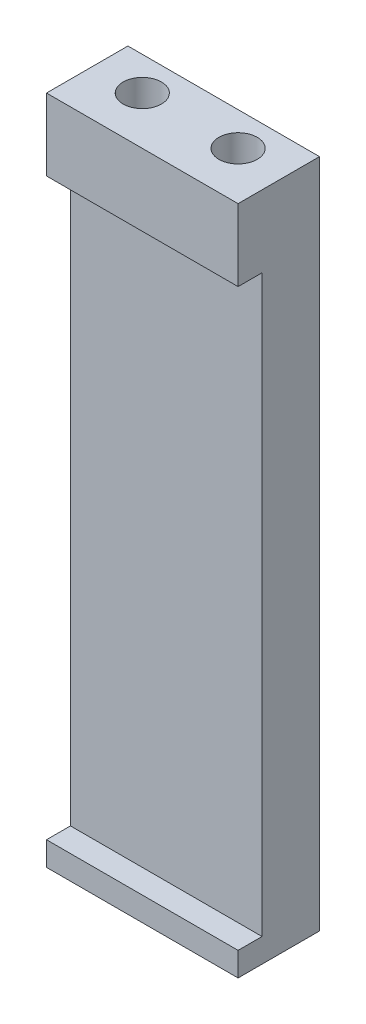
ISO-10303-21;
HEADER;
FILE_DESCRIPTION(('STEP AP214'),'2;1');
FILE_NAME('part.step','',(''),(''),'','','');
FILE_SCHEMA(('AUTOMOTIVE_DESIGN { 1 0 10303 214 1 1 1 1 }'));
ENDSEC;
DATA;
#1=APPLICATION_CONTEXT('core data for automotive mechanical design processes');
#2=APPLICATION_PROTOCOL_DEFINITION('international standard','automotive_design',2000,#1);
#3=PRODUCT_CONTEXT('',#1,'mechanical');
#4=PRODUCT('Part','Part','',(#3));
#5=PRODUCT_RELATED_PRODUCT_CATEGORY('part','',(#4));
#6=PRODUCT_DEFINITION_FORMATION('','',#4);
#7=PRODUCT_DEFINITION_CONTEXT('part definition',#1,'design');
#8=PRODUCT_DEFINITION('design','',#6,#7);
#9=PRODUCT_DEFINITION_SHAPE('','',#8);
#10=(LENGTH_UNIT() NAMED_UNIT(*) SI_UNIT(.MILLI.,.METRE.));
#11=(NAMED_UNIT(*) PLANE_ANGLE_UNIT() SI_UNIT($,.RADIAN.));
#12=(NAMED_UNIT(*) SI_UNIT($,.STERADIAN.) SOLID_ANGLE_UNIT());
#13=UNCERTAINTY_MEASURE_WITH_UNIT(LENGTH_MEASURE(1.E-05),#10,'distance_accuracy_value','');
#14=(GEOMETRIC_REPRESENTATION_CONTEXT(3) GLOBAL_UNCERTAINTY_ASSIGNED_CONTEXT((#13)) GLOBAL_UNIT_ASSIGNED_CONTEXT((#10,
#11,#12)) REPRESENTATION_CONTEXT('',''));
#15=CARTESIAN_POINT('',(0.,0.,0.));
#16=DIRECTION('',(0.,0.,1.));
#17=DIRECTION('',(1.,0.,0.));
#18=AXIS2_PLACEMENT_3D('',#15,#16,#17);
#19=CARTESIAN_POINT('',(10.,61.25,2.5));
#20=DIRECTION('',(0.,0.,1.));
#21=DIRECTION('',(1.,0.,0.));
#22=AXIS2_PLACEMENT_3D('',#19,#20,#21);
#23=PLANE('',#22);
#24=DIRECTION('',(0.,1.,0.));
#25=VECTOR('',#24,1.);
#26=CARTESIAN_POINT('',(20.,60.,2.5));
#27=LINE('',#26,#25);
#28=CARTESIAN_POINT('',(20.,60.,2.5));
#29=VERTEX_POINT('',#28);
#30=CARTESIAN_POINT('',(20.,67.5,2.5));
#31=VERTEX_POINT('',#30);
#32=EDGE_CURVE('E10',#29,#31,#27,.T.);
#33=ORIENTED_EDGE('',*,*,#32,.T.);
#34=DIRECTION('',(1.,0.,0.));
#35=VECTOR('',#34,1.);
#36=CARTESIAN_POINT('',(22.5,67.5,2.5));
#37=LINE('',#36,#35);
#38=CARTESIAN_POINT('',(0.,67.5,2.5));
#39=VERTEX_POINT('',#38);
#40=EDGE_CURVE('E131',#39,#31,#37,.T.);
#41=ORIENTED_EDGE('',*,*,#40,.F.);
#42=DIRECTION('',(0.,1.,0.));
#43=VECTOR('',#42,1.);
#44=CARTESIAN_POINT('',(0.,62.5,2.5));
#45=LINE('',#44,#43);
#46=CARTESIAN_POINT('',(0.,60.,2.5));
#47=VERTEX_POINT('',#46);
#48=EDGE_CURVE('E26',#47,#39,#45,.T.);
#49=ORIENTED_EDGE('',*,*,#48,.F.);
#50=DIRECTION('',(1.,0.,0.));
#51=VECTOR('',#50,1.);
#52=CARTESIAN_POINT('',(20.,60.,2.5));
#53=LINE('',#52,#51);
#54=EDGE_CURVE('E20',#47,#29,#53,.T.);
#55=ORIENTED_EDGE('',*,*,#54,.T.);
#56=EDGE_LOOP('',(#33,#41,#49,#55));
#57=FACE_BOUND('',#56,.T.);
#58=ADVANCED_FACE('F16',(#57),#23,.T.);
#59=CARTESIAN_POINT('',(20.,60.,0.));
#60=DIRECTION('',(1.,0.,0.));
#61=DIRECTION('',(0.,1.,0.));
#62=AXIS2_PLACEMENT_3D('',#59,#60,#61);
#63=PLANE('',#62);
#64=ORIENTED_EDGE('',*,*,#32,.F.);
#65=DIRECTION('',(0.,0.,1.));
#66=VECTOR('',#65,1.);
#67=CARTESIAN_POINT('',(20.,60.,0.));
#68=LINE('',#67,#66);
#69=CARTESIAN_POINT('',(20.,60.,0.));
#70=VERTEX_POINT('',#69);
#71=EDGE_CURVE('E192',#70,#29,#68,.T.);
#72=ORIENTED_EDGE('',*,*,#71,.F.);
#73=DIRECTION('',(0.,-1.,0.));
#74=VECTOR('',#73,1.);
#75=CARTESIAN_POINT('',(20.,0.,0.));
#76=LINE('',#75,#74);
#77=CARTESIAN_POINT('',(20.,0.,0.));
#78=VERTEX_POINT('',#77);
#79=EDGE_CURVE('E149',#70,#78,#76,.T.);
#80=ORIENTED_EDGE('',*,*,#79,.T.);
#81=DIRECTION('',(0.,0.,1.));
#82=VECTOR('',#81,1.);
#83=CARTESIAN_POINT('',(20.,0.,0.));
#84=LINE('',#83,#82);
#85=CARTESIAN_POINT('',(20.,0.,2.5));
#86=VERTEX_POINT('',#85);
#87=EDGE_CURVE('E172',#78,#86,#84,.T.);
#88=ORIENTED_EDGE('',*,*,#87,.T.);
#89=DIRECTION('',(0.,1.,0.));
#90=VECTOR('',#89,1.);
#91=CARTESIAN_POINT('',(20.,0.,2.5));
#92=LINE('',#91,#90);
#93=CARTESIAN_POINT('',(20.,-2.5,2.5));
#94=VERTEX_POINT('',#93);
#95=EDGE_CURVE('E190',#94,#86,#92,.T.);
#96=ORIENTED_EDGE('',*,*,#95,.F.);
#97=DIRECTION('',(0.,0.,1.));
#98=VECTOR('',#97,1.);
#99=CARTESIAN_POINT('',(20.,-2.5,0.));
#100=LINE('',#99,#98);
#101=CARTESIAN_POINT('',(20.,-2.5,-6.));
#102=VERTEX_POINT('',#101);
#103=EDGE_CURVE('E176',#102,#94,#100,.T.);
#104=ORIENTED_EDGE('',*,*,#103,.F.);
#105=DIRECTION('',(0.,1.,0.));
#106=VECTOR('',#105,1.);
#107=CARTESIAN_POINT('',(20.,45.,-6.));
#108=LINE('',#107,#106);
#109=CARTESIAN_POINT('',(20.,67.5,-6.));
#110=VERTEX_POINT('',#109);
#111=EDGE_CURVE('E147',#102,#110,#108,.T.);
#112=ORIENTED_EDGE('',*,*,#111,.T.);
#113=DIRECTION('',(0.,0.,-1.));
#114=VECTOR('',#113,1.);
#115=CARTESIAN_POINT('',(20.,67.5,0.));
#116=LINE('',#115,#114);
#117=EDGE_CURVE('E123',#31,#110,#116,.T.);
#118=ORIENTED_EDGE('',*,*,#117,.F.);
#119=EDGE_LOOP('',(#64,#72,#80,#88,#96,#104,#112,#118));
#120=FACE_BOUND('',#119,.T.);
#121=ADVANCED_FACE('F247',(#120),#63,.T.);
#122=CARTESIAN_POINT('',(0.,62.5,0.));
#123=DIRECTION('',(-1.,0.,0.));
#124=DIRECTION('',(0.,1.,0.));
#125=AXIS2_PLACEMENT_3D('',#122,#123,#124);
#126=PLANE('',#125);
#127=DIRECTION('',(0.,0.,1.));
#128=VECTOR('',#127,1.);
#129=CARTESIAN_POINT('',(0.,60.,0.));
#130=LINE('',#129,#128);
#131=CARTESIAN_POINT('',(0.,60.,0.));
#132=VERTEX_POINT('',#131);
#133=EDGE_CURVE('E159',#132,#47,#130,.T.);
#134=ORIENTED_EDGE('',*,*,#133,.T.);
#135=ORIENTED_EDGE('',*,*,#48,.T.);
#136=DIRECTION('',(0.,0.,1.));
#137=VECTOR('',#136,1.);
#138=CARTESIAN_POINT('',(0.,67.5,0.));
#139=LINE('',#138,#137);
#140=CARTESIAN_POINT('',(0.,67.5,-6.));
#141=VERTEX_POINT('',#140);
#142=EDGE_CURVE('E121',#141,#39,#139,.T.);
#143=ORIENTED_EDGE('',*,*,#142,.F.);
#144=DIRECTION('',(0.,1.,0.));
#145=VECTOR('',#144,1.);
#146=CARTESIAN_POINT('',(0.,46.25,-6.));
#147=LINE('',#146,#145);
#148=CARTESIAN_POINT('',(0.,-2.5,-6.));
#149=VERTEX_POINT('',#148);
#150=EDGE_CURVE('E103',#149,#141,#147,.T.);
#151=ORIENTED_EDGE('',*,*,#150,.F.);
#152=DIRECTION('',(0.,0.,1.));
#153=VECTOR('',#152,1.);
#154=CARTESIAN_POINT('',(0.,-2.5,0.));
#155=LINE('',#154,#153);
#156=CARTESIAN_POINT('',(0.,-2.5,2.5));
#157=VERTEX_POINT('',#156);
#158=EDGE_CURVE('E184',#149,#157,#155,.T.);
#159=ORIENTED_EDGE('',*,*,#158,.T.);
#160=DIRECTION('',(0.,-1.,0.));
#161=VECTOR('',#160,1.);
#162=CARTESIAN_POINT('',(0.,0.,2.5));
#163=LINE('',#162,#161);
#164=CARTESIAN_POINT('',(0.,0.,2.5));
#165=VERTEX_POINT('',#164);
#166=EDGE_CURVE('E187',#165,#157,#163,.T.);
#167=ORIENTED_EDGE('',*,*,#166,.F.);
#168=DIRECTION('',(0.,0.,1.));
#169=VECTOR('',#168,1.);
#170=CARTESIAN_POINT('',(0.,0.,0.));
#171=LINE('',#170,#169);
#172=CARTESIAN_POINT('',(0.,0.,0.));
#173=VERTEX_POINT('',#172);
#174=EDGE_CURVE('E115',#173,#165,#171,.T.);
#175=ORIENTED_EDGE('',*,*,#174,.F.);
#176=DIRECTION('',(0.,1.,0.));
#177=VECTOR('',#176,1.);
#178=CARTESIAN_POINT('',(0.,60.,0.));
#179=LINE('',#178,#177);
#180=EDGE_CURVE('E156',#173,#132,#179,.T.);
#181=ORIENTED_EDGE('',*,*,#180,.T.);
#182=EDGE_LOOP('',(#134,#135,#143,#151,#159,#167,#175,#181));
#183=FACE_BOUND('',#182,.T.);
#184=ADVANCED_FACE('F128',(#183),#126,.T.);
#185=CARTESIAN_POINT('',(0.,60.,0.));
#186=DIRECTION('',(0.,-1.,0.));
#187=DIRECTION('',(0.,0.,-1.));
#188=AXIS2_PLACEMENT_3D('',#185,#186,#187);
#189=PLANE('',#188);
#190=DIRECTION('',(-1.,0.,0.));
#191=VECTOR('',#190,1.);
#192=CARTESIAN_POINT('',(20.,60.,0.));
#193=LINE('',#192,#191);
#194=EDGE_CURVE('E125',#70,#132,#193,.T.);
#195=ORIENTED_EDGE('',*,*,#194,.F.);
#196=ORIENTED_EDGE('',*,*,#71,.T.);
#197=ORIENTED_EDGE('',*,*,#54,.F.);
#198=ORIENTED_EDGE('',*,*,#133,.F.);
#199=EDGE_LOOP('',(#195,#196,#197,#198));
#200=FACE_BOUND('',#199,.T.);
#201=ADVANCED_FACE('F18',(#200),#189,.T.);
#202=CARTESIAN_POINT('',(10.,-1.25,2.5));
#203=DIRECTION('',(0.,0.,1.));
#204=DIRECTION('',(1.,0.,0.));
#205=AXIS2_PLACEMENT_3D('',#202,#203,#204);
#206=PLANE('',#205);
#207=ORIENTED_EDGE('',*,*,#166,.T.);
#208=DIRECTION('',(1.,0.,0.));
#209=VECTOR('',#208,1.);
#210=CARTESIAN_POINT('',(-2.5,-2.5,2.5));
#211=LINE('',#210,#209);
#212=EDGE_CURVE('E180',#157,#94,#211,.T.);
#213=ORIENTED_EDGE('',*,*,#212,.T.);
#214=ORIENTED_EDGE('',*,*,#95,.T.);
#215=DIRECTION('',(-1.,0.,0.));
#216=VECTOR('',#215,1.);
#217=CARTESIAN_POINT('',(0.,0.,2.5));
#218=LINE('',#217,#216);
#219=EDGE_CURVE('E166',#86,#165,#218,.T.);
#220=ORIENTED_EDGE('',*,*,#219,.T.);
#221=EDGE_LOOP('',(#207,#213,#214,#220));
#222=FACE_BOUND('',#221,.T.);
#223=ADVANCED_FACE('F263',(#222),#206,.T.);
#224=CARTESIAN_POINT('',(0.,-2.5,0.));
#225=DIRECTION('',(0.,-1.,0.));
#226=DIRECTION('',(0.,0.,-1.));
#227=AXIS2_PLACEMENT_3D('',#224,#225,#226);
#228=PLANE('',#227);
#229=ORIENTED_EDGE('',*,*,#103,.T.);
#230=ORIENTED_EDGE('',*,*,#212,.F.);
#231=ORIENTED_EDGE('',*,*,#158,.F.);
#232=DIRECTION('',(-1.,0.,0.));
#233=VECTOR('',#232,1.);
#234=CARTESIAN_POINT('',(5.,-2.5,-6.));
#235=LINE('',#234,#233);
#236=EDGE_CURVE('E110',#102,#149,#235,.T.);
#237=ORIENTED_EDGE('',*,*,#236,.F.);
#238=EDGE_LOOP('',(#229,#230,#231,#237));
#239=FACE_BOUND('',#238,.T.);
#240=ADVANCED_FACE('F259',(#239),#228,.T.);
#241=CARTESIAN_POINT('',(20.,0.,0.));
#242=DIRECTION('',(0.,1.,0.));
#243=DIRECTION('',(1.,0.,0.));
#244=AXIS2_PLACEMENT_3D('',#241,#242,#243);
#245=PLANE('',#244);
#246=DIRECTION('',(1.,0.,0.));
#247=VECTOR('',#246,1.);
#248=CARTESIAN_POINT('',(0.,0.,0.));
#249=LINE('',#248,#247);
#250=EDGE_CURVE('E145',#173,#78,#249,.T.);
#251=ORIENTED_EDGE('',*,*,#250,.F.);
#252=ORIENTED_EDGE('',*,*,#174,.T.);
#253=ORIENTED_EDGE('',*,*,#219,.F.);
#254=ORIENTED_EDGE('',*,*,#87,.F.);
#255=EDGE_LOOP('',(#251,#252,#253,#254));
#256=FACE_BOUND('',#255,.T.);
#257=ADVANCED_FACE('F256',(#256),#245,.T.);
#258=CARTESIAN_POINT('',(10.,30.,-6.));
#259=DIRECTION('',(0.,0.,-1.));
#260=DIRECTION('',(0.,-1.,0.));
#261=AXIS2_PLACEMENT_3D('',#258,#259,#260);
#262=PLANE('',#261);
#263=ORIENTED_EDGE('',*,*,#111,.F.);
#264=ORIENTED_EDGE('',*,*,#236,.T.);
#265=ORIENTED_EDGE('',*,*,#150,.T.);
#266=DIRECTION('',(-1.,0.,0.));
#267=VECTOR('',#266,1.);
#268=CARTESIAN_POINT('',(15.,67.5,-6.));
#269=LINE('',#268,#267);
#270=EDGE_CURVE('E107',#110,#141,#269,.T.);
#271=ORIENTED_EDGE('',*,*,#270,.F.);
#272=EDGE_LOOP('',(#263,#264,#265,#271));
#273=FACE_BOUND('',#272,.T.);
#274=ADVANCED_FACE('F106',(#273),#262,.T.);
#275=CARTESIAN_POINT('',(10.,30.,0.));
#276=DIRECTION('',(0.,0.,1.));
#277=DIRECTION('',(1.,0.,0.));
#278=AXIS2_PLACEMENT_3D('',#275,#276,#277);
#279=PLANE('',#278);
#280=ORIENTED_EDGE('',*,*,#194,.T.);
#281=ORIENTED_EDGE('',*,*,#180,.F.);
#282=ORIENTED_EDGE('',*,*,#250,.T.);
#283=ORIENTED_EDGE('',*,*,#79,.F.);
#284=EDGE_LOOP('',(#280,#281,#282,#283));
#285=FACE_BOUND('',#284,.T.);
#286=ADVANCED_FACE('F210',(#285),#279,.T.);
#287=CARTESIAN_POINT('',(20.,67.5,0.));
#288=DIRECTION('',(0.,1.,0.));
#289=DIRECTION('',(1.,0.,0.));
#290=AXIS2_PLACEMENT_3D('',#287,#288,#289);
#291=PLANE('',#290);
#292=CARTESIAN_POINT('',(15.,67.5,-2.5));
#293=DIRECTION('',(0.,-1.,0.));
#294=DIRECTION('',(0.,0.,1.));
#295=AXIS2_PLACEMENT_3D('',#292,#293,#294);
#296=CIRCLE('',#295,2.);
#297=CARTESIAN_POINT('',(15.,67.5,-0.5));
#298=VERTEX_POINT('',#297);
#299=EDGE_CURVE('E132',#298,#298,#296,.T.);
#300=ORIENTED_EDGE('',*,*,#299,.T.);
#301=EDGE_LOOP('',(#300));
#302=FACE_BOUND('',#301,.T.);
#303=CARTESIAN_POINT('',(5.,67.5,-2.5));
#304=DIRECTION('',(0.,-1.,0.));
#305=DIRECTION('',(0.,0.,1.));
#306=AXIS2_PLACEMENT_3D('',#303,#304,#305);
#307=CIRCLE('',#306,2.);
#308=CARTESIAN_POINT('',(5.,67.5,-0.5));
#309=VERTEX_POINT('',#308);
#310=EDGE_CURVE('E221',#309,#309,#307,.T.);
#311=ORIENTED_EDGE('',*,*,#310,.T.);
#312=EDGE_LOOP('',(#311));
#313=FACE_BOUND('',#312,.T.);
#314=ORIENTED_EDGE('',*,*,#142,.T.);
#315=ORIENTED_EDGE('',*,*,#40,.T.);
#316=ORIENTED_EDGE('',*,*,#117,.T.);
#317=ORIENTED_EDGE('',*,*,#270,.T.);
#318=EDGE_LOOP('',(#314,#315,#316,#317));
#319=FACE_BOUND('',#318,.T.);
#320=ADVANCED_FACE('F119',(#302,#313,#319),#291,.T.);
#321=CARTESIAN_POINT('',(15.,64.5,-2.5));
#322=DIRECTION('',(0.,-1.,0.));
#323=DIRECTION('',(0.,0.,1.));
#324=AXIS2_PLACEMENT_3D('',#321,#322,#323);
#325=CYLINDRICAL_SURFACE('',#324,2.);
#326=CARTESIAN_POINT('',(15.,61.5,-2.5));
#327=DIRECTION('',(0.,-1.,0.));
#328=DIRECTION('',(0.,0.,1.));
#329=AXIS2_PLACEMENT_3D('',#326,#327,#328);
#330=CIRCLE('',#329,2.);
#331=CARTESIAN_POINT('',(15.,61.5,-0.5));
#332=VERTEX_POINT('',#331);
#333=EDGE_CURVE('E141',#332,#332,#330,.T.);
#334=ORIENTED_EDGE('',*,*,#333,.T.);
#335=EDGE_LOOP('',(#334));
#336=FACE_BOUND('',#335,.T.);
#337=ORIENTED_EDGE('',*,*,#299,.F.);
#338=EDGE_LOOP('',(#337));
#339=FACE_BOUND('',#338,.T.);
#340=ADVANCED_FACE('F310',(#336,#339),#325,.F.);
#341=CARTESIAN_POINT('',(15.,60.8991393809725,-2.5));
#342=DIRECTION('',(0.,1.,0.));
#343=DIRECTION('',(0.,0.,1.));
#344=AXIS2_PLACEMENT_3D('',#341,#342,#343);
#345=CONICAL_SURFACE('',#344,1.,1.02974425867665);
#346=CARTESIAN_POINT('',(15.,60.2982787619449,-2.5));
#347=VERTEX_POINT('',#346);
#348=VERTEX_LOOP('',#347);
#349=FACE_BOUND('',#348,.T.);
#350=ORIENTED_EDGE('',*,*,#333,.F.);
#351=EDGE_LOOP('',(#350));
#352=FACE_BOUND('',#351,.T.);
#353=ADVANCED_FACE('F244',(#349,#352),#345,.F.);
#354=CARTESIAN_POINT('',(5.,64.5,-2.5));
#355=DIRECTION('',(0.,-1.,0.));
#356=DIRECTION('',(0.,0.,1.));
#357=AXIS2_PLACEMENT_3D('',#354,#355,#356);
#358=CYLINDRICAL_SURFACE('',#357,2.);
#359=CARTESIAN_POINT('',(5.,61.5,-2.5));
#360=DIRECTION('',(0.,-1.,0.));
#361=DIRECTION('',(0.,0.,1.));
#362=AXIS2_PLACEMENT_3D('',#359,#360,#361);
#363=CIRCLE('',#362,2.);
#364=CARTESIAN_POINT('',(5.,61.5,-0.5));
#365=VERTEX_POINT('',#364);
#366=EDGE_CURVE('E227',#365,#365,#363,.T.);
#367=ORIENTED_EDGE('',*,*,#366,.T.);
#368=EDGE_LOOP('',(#367));
#369=FACE_BOUND('',#368,.T.);
#370=ORIENTED_EDGE('',*,*,#310,.F.);
#371=EDGE_LOOP('',(#370));
#372=FACE_BOUND('',#371,.T.);
#373=ADVANCED_FACE('F234',(#369,#372),#358,.F.);
#374=CARTESIAN_POINT('',(5.,60.8991393809725,-2.5));
#375=DIRECTION('',(0.,1.,0.));
#376=DIRECTION('',(0.,0.,1.));
#377=AXIS2_PLACEMENT_3D('',#374,#375,#376);
#378=CONICAL_SURFACE('',#377,1.,1.02974425867665);
#379=CARTESIAN_POINT('',(5.,60.2982787619449,-2.5));
#380=VERTEX_POINT('',#379);
#381=VERTEX_LOOP('',#380);
#382=FACE_BOUND('',#381,.T.);
#383=ORIENTED_EDGE('',*,*,#366,.F.);
#384=EDGE_LOOP('',(#383));
#385=FACE_BOUND('',#384,.T.);
#386=ADVANCED_FACE('F237',(#382,#385),#378,.F.);
#387=CLOSED_SHELL('',(#58,#121,#184,#201,#223,#240,#257,#274,#286,#320,#340,#353,#373,#386));
#388=MANIFOLD_SOLID_BREP('B1',#387);
#389=ADVANCED_BREP_SHAPE_REPRESENTATION('',(#18,#388),#14);
#390=SHAPE_DEFINITION_REPRESENTATION(#9,#389);
ENDSEC;
END-ISO-10303-21;
